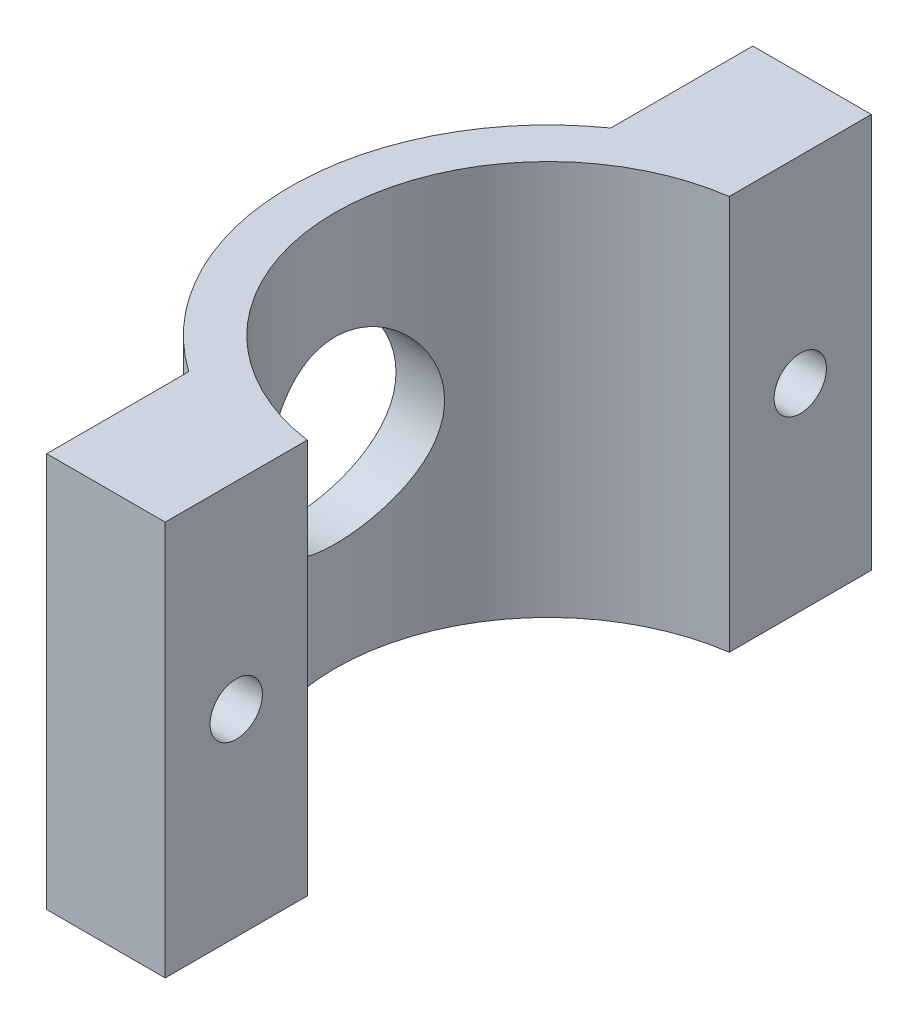
ISO-10303-21;
HEADER;
FILE_DESCRIPTION(('STEP AP214'),'2;1');
FILE_NAME('part.step','',(''),(''),'','','');
FILE_SCHEMA(('AUTOMOTIVE_DESIGN { 1 0 10303 214 1 1 1 1 }'));
ENDSEC;
DATA;
#1=APPLICATION_CONTEXT('core data for automotive mechanical design processes');
#2=APPLICATION_PROTOCOL_DEFINITION('international standard','automotive_design',2000,#1);
#3=PRODUCT_CONTEXT('',#1,'mechanical');
#4=PRODUCT('Part','Part','',(#3));
#5=PRODUCT_RELATED_PRODUCT_CATEGORY('part','',(#4));
#6=PRODUCT_DEFINITION_FORMATION('','',#4);
#7=PRODUCT_DEFINITION_CONTEXT('part definition',#1,'design');
#8=PRODUCT_DEFINITION('design','',#6,#7);
#9=PRODUCT_DEFINITION_SHAPE('','',#8);
#10=(LENGTH_UNIT() NAMED_UNIT(*) SI_UNIT(.MILLI.,.METRE.));
#11=(NAMED_UNIT(*) PLANE_ANGLE_UNIT() SI_UNIT($,.RADIAN.));
#12=(NAMED_UNIT(*) SI_UNIT($,.STERADIAN.) SOLID_ANGLE_UNIT());
#13=UNCERTAINTY_MEASURE_WITH_UNIT(LENGTH_MEASURE(1.E-05),#10,'distance_accuracy_value','');
#14=(GEOMETRIC_REPRESENTATION_CONTEXT(3) GLOBAL_UNCERTAINTY_ASSIGNED_CONTEXT((#13)) GLOBAL_UNIT_ASSIGNED_CONTEXT((#10,
#11,#12)) REPRESENTATION_CONTEXT('',''));
#15=CARTESIAN_POINT('',(0.,0.,0.));
#16=DIRECTION('',(0.,0.,1.));
#17=DIRECTION('',(1.,0.,0.));
#18=AXIS2_PLACEMENT_3D('',#15,#16,#17);
#19=CARTESIAN_POINT('',(-16.5892912198866,20.2908540828622,23.5900554612146));
#20=DIRECTION('',(0.,-1.,0.));
#21=DIRECTION('',(0.,0.,-1.));
#22=AXIS2_PLACEMENT_3D('',#19,#20,#21);
#23=CYLINDRICAL_SURFACE('',#22,14.25);
#24=CARTESIAN_POINT('',(-16.5892912198866,-6.10914591713783,23.5900554612146));
#25=DIRECTION('',(0.,-1.,0.));
#26=DIRECTION('',(0.,0.,-1.));
#27=AXIS2_PLACEMENT_3D('',#24,#25,#26);
#28=CIRCLE('',#27,14.25);
#29=CARTESIAN_POINT('',(-18.5892912198866,-6.10914591713783,37.6990065207371));
#30=VERTEX_POINT('',#29);
#31=CARTESIAN_POINT('',(-18.5892912198866,-6.10914591713783,9.48110440169217));
#32=VERTEX_POINT('',#31);
#33=EDGE_CURVE('E130',#30,#32,#28,.T.);
#34=ORIENTED_EDGE('',*,*,#33,.T.);
#35=DIRECTION('',(0.,-1.,0.));
#36=VECTOR('',#35,1.);
#37=CARTESIAN_POINT('',(-18.5892912198866,20.2908540828622,9.48110440169217));
#38=LINE('',#37,#36);
#39=CARTESIAN_POINT('',(-18.5892912198866,20.2908540828622,9.48110440169217));
#40=VERTEX_POINT('',#39);
#41=EDGE_CURVE('E148',#40,#32,#38,.T.);
#42=ORIENTED_EDGE('',*,*,#41,.F.);
#43=CARTESIAN_POINT('',(-16.5892912198866,20.2908540828622,23.5900554612146));
#44=DIRECTION('',(0.,-1.,0.));
#45=DIRECTION('',(0.,0.,-1.));
#46=AXIS2_PLACEMENT_3D('',#43,#44,#45);
#47=CIRCLE('',#46,14.25);
#48=CARTESIAN_POINT('',(-18.5892912198866,20.2908540828622,37.6990065207371));
#49=VERTEX_POINT('',#48);
#50=EDGE_CURVE('E137',#49,#40,#47,.T.);
#51=ORIENTED_EDGE('',*,*,#50,.F.);
#52=DIRECTION('',(0.,-1.,0.));
#53=VECTOR('',#52,1.);
#54=CARTESIAN_POINT('',(-18.5892912198866,20.2908540828622,37.6990065207371));
#55=LINE('',#54,#53);
#56=EDGE_CURVE('E150',#49,#30,#55,.T.);
#57=ORIENTED_EDGE('',*,*,#56,.T.);
#58=EDGE_LOOP('',(#34,#42,#51,#57));
#59=FACE_BOUND('',#58,.T.);
#60=CARTESIAN_POINT('',(-29.5145571745972,7.09085408286217,17.5900554612146));
#61=CARTESIAN_POINT('',(-29.5145583836085,7.25076014715918,17.5900566121758));
#62=CARTESIAN_POINT('',(-29.517534878097,7.41072103591643,17.5964572174918));
#63=CARTESIAN_POINT('',(-29.5293428523807,7.72947618653543,17.6219941731038));
#64=CARTESIAN_POINT('',(-29.5381781025637,7.88826963051054,17.641138724766));
#65=CARTESIAN_POINT('',(-29.5614255269244,8.20376301387036,17.6920037888573));
#66=CARTESIAN_POINT('',(-29.5758494163356,8.36045783535128,17.7237507225926));
#67=CARTESIAN_POINT('',(-29.6097971951327,8.6703531428413,17.7994904152573));
#68=CARTESIAN_POINT('',(-29.6293232344606,8.82355212611451,17.8434883370177));
#69=CARTESIAN_POINT('',(-29.6727523258704,9.12470529882653,17.9430670699224));
#70=CARTESIAN_POINT('',(-29.696634856618,9.27268035065628,17.9985937374316));
#71=CARTESIAN_POINT('',(-29.7481231376349,9.56327085587394,18.120865226693));
#72=CARTESIAN_POINT('',(-29.7757303084003,9.70588423777432,18.1876143308395));
#73=CARTESIAN_POINT('',(-29.8629509353894,10.1242959055126,18.4038610497906));
#74=CARTESIAN_POINT('',(-29.9270208142709,10.3910413869939,18.5694833488865));
#75=CARTESIAN_POINT('',(-30.0642747362718,10.909079991692,18.9499578226911));
#76=CARTESIAN_POINT('',(-30.1377712880654,11.1585953559592,19.167097908435));
#77=CARTESIAN_POINT('',(-30.2830797042312,11.6191116409902,19.6399129937869));
#78=CARTESIAN_POINT('',(-30.3548909014979,11.8300975276433,19.895602964728));
#79=CARTESIAN_POINT('',(-30.4573334203122,12.1176392167381,20.3095894557195));
#80=CARTESIAN_POINT('',(-30.4912637597656,12.2103013784583,20.456140822951));
#81=CARTESIAN_POINT('',(-30.5557314833105,12.382863561878,20.757265157626));
#82=CARTESIAN_POINT('',(-30.5862701708466,12.4627684915068,20.9118350097488));
#83=CARTESIAN_POINT('',(-30.6430735404045,12.6090823680126,21.2279592447891));
#84=CARTESIAN_POINT('',(-30.6693388250895,12.6754932182422,21.3895126387674));
#85=CARTESIAN_POINT('',(-30.7168255146891,12.7941588100694,21.7184583847181));
#86=CARTESIAN_POINT('',(-30.7380472810556,12.8464145661521,21.8858503172756));
#87=CARTESIAN_POINT('',(-30.7738261249559,12.9338013423763,22.2161598579551));
#88=CARTESIAN_POINT('',(-30.7886767362385,12.9696929697881,22.3788446501493));
#89=CARTESIAN_POINT('',(-30.8128573829621,13.0278597349649,22.7070318464868));
#90=CARTESIAN_POINT('',(-30.82218778359,13.0501357734662,22.8725340634993));
#91=CARTESIAN_POINT('',(-30.8350585687759,13.0808107880413,23.2049881937949));
#92=CARTESIAN_POINT('',(-30.838600896368,13.0892144210385,23.371939601662));
#93=CARTESIAN_POINT('',(-30.8397983291903,13.0920586044305,23.705979456996));
#94=CARTESIAN_POINT('',(-30.8374536683336,13.0864997096107,23.8730678987543));
#95=CARTESIAN_POINT('',(-30.8272752807448,13.0622692488414,24.1956170485107));
#96=CARTESIAN_POINT('',(-30.8197931394654,13.0444374109857,24.3511528233977));
#97=CARTESIAN_POINT('',(-30.7999025487061,12.9967362911083,24.6600990531203));
#98=CARTESIAN_POINT('',(-30.7874925022162,12.9668631067418,24.8135088022686));
#99=CARTESIAN_POINT('',(-30.7580598708356,12.8953837104742,25.1170596847662));
#100=CARTESIAN_POINT('',(-30.7410387983224,12.853781345463,25.2672018724347));
#101=CARTESIAN_POINT('',(-30.7027901910648,12.7592068233655,25.5633662128153));
#102=CARTESIAN_POINT('',(-30.6815610557209,12.7062303393236,25.7093867735871));
#103=CARTESIAN_POINT('',(-30.6350567564275,12.5884898066774,25.9985238119138));
#104=CARTESIAN_POINT('',(-30.6097261359449,12.5235622322296,26.1415648474036));
#105=CARTESIAN_POINT('',(-30.5558539250813,12.3829786056552,26.4216645186344));
#106=CARTESIAN_POINT('',(-30.5273111629007,12.3073186356776,26.5587209456984));
#107=CARTESIAN_POINT('',(-30.4378419829683,12.0650325806581,26.9597667493119));
#108=CARTESIAN_POINT('',(-30.3730438580912,11.8830250728856,27.2138162957244));
#109=CARTESIAN_POINT('',(-30.2342100694426,11.4683180092497,27.7069871449134));
#110=CARTESIAN_POINT('',(-30.1598451980582,11.2329178865633,27.9437286500461));
#111=CARTESIAN_POINT('',(-30.0136614884827,10.7254177530026,28.3755323963779));
#112=CARTESIAN_POINT('',(-29.9418436843916,10.4533030467524,28.5705778671184));
#113=CARTESIAN_POINT('',(-29.8409718801019,10.0175432691812,28.8307172712376));
#114=CARTESIAN_POINT('',(-29.8079988499797,9.86488181826001,28.9131162739378));
#115=CARTESIAN_POINT('',(-29.7459672917838,9.5523650451889,29.0646395111713));
#116=CARTESIAN_POINT('',(-29.7169071581055,9.39251270986488,29.1337691955772));
#117=CARTESIAN_POINT('',(-29.663725199551,9.06674380760944,29.2580579244257));
#118=CARTESIAN_POINT('',(-29.6396015068586,8.90082956245052,29.3132222548625));
#119=CARTESIAN_POINT('',(-29.5971792513203,8.56412388813348,29.4089985440882));
#120=CARTESIAN_POINT('',(-29.5788801564926,8.39333290593923,29.4496118319197));
#121=CARTESIAN_POINT('',(-29.5498196137541,8.05965610533712,29.5135978529789));
#122=CARTESIAN_POINT('',(-29.5386412410059,7.89699009129641,29.5379295823282));
#123=CARTESIAN_POINT('',(-29.5224008780864,7.56991029036197,29.5731612231141));
#124=CARTESIAN_POINT('',(-29.5173384639656,7.40549662541007,29.5840620655618));
#125=CARTESIAN_POINT('',(-29.5135177053477,7.07630650617094,29.5922958955461));
#126=CARTESIAN_POINT('',(-29.5147574803482,6.91153017476661,29.5896329303699));
#127=CARTESIAN_POINT('',(-29.5234908115885,6.58292405031146,29.5707819122945));
#128=CARTESIAN_POINT('',(-29.5309841725202,6.41909422786074,29.5545942817895));
#129=CARTESIAN_POINT('',(-29.5512514938468,6.10449318967008,29.5104126580604));
#130=CARTESIAN_POINT('',(-29.5636425017483,5.95357620950677,29.4832723829172));
#131=CARTESIAN_POINT('',(-29.5932526635943,5.65466502127067,29.417643457986));
#132=CARTESIAN_POINT('',(-29.610473366726,5.50667176735245,29.3791511666875));
#133=CARTESIAN_POINT('',(-29.6492250765592,5.21460118236085,29.2911898716802));
#134=CARTESIAN_POINT('',(-29.6707552843622,5.07052313109901,29.24172290228));
#135=CARTESIAN_POINT('',(-29.7175288423381,4.78701314604419,29.1322049510754));
#136=CARTESIAN_POINT('',(-29.7427736210167,4.64758302511276,29.0721498956613));
#137=CARTESIAN_POINT('',(-29.7974336746334,4.36834373310683,28.9391541136997));
#138=CARTESIAN_POINT('',(-29.8269803952604,4.22876915615258,28.8657749965815));
#139=CARTESIAN_POINT('',(-29.8885765196168,3.95618869826312,28.7085163027878));
#140=CARTESIAN_POINT('',(-29.9206267761202,3.82318508098578,28.6246331422229));
#141=CARTESIAN_POINT('',(-29.9864027473475,3.5644165572684,28.4468940839713));
#142=CARTESIAN_POINT('',(-30.0201288063038,3.43865314961398,28.3530361327801));
#143=CARTESIAN_POINT('',(-30.0884230728242,3.19499208553419,28.1558874684571));
#144=CARTESIAN_POINT('',(-30.1229913184433,3.07709478545121,28.0525963284938));
#145=CARTESIAN_POINT('',(-30.1950497326266,2.84021404957303,27.8280821245168));
#146=CARTESIAN_POINT('',(-30.2325421435275,2.72196662065797,27.7060817513037));
#147=CARTESIAN_POINT('',(-30.3065251054627,2.49614132003793,27.4523667804318));
#148=CARTESIAN_POINT('',(-30.3430159629879,2.38856015735748,27.3206552010807));
#149=CARTESIAN_POINT('',(-30.4140464115812,2.18468530533864,27.04815828095));
#150=CARTESIAN_POINT('',(-30.4485850131746,2.08839731368145,26.9073684149925));
#151=CARTESIAN_POINT('',(-30.5147415946124,1.90792875409695,26.6176610668573));
#152=CARTESIAN_POINT('',(-30.5463608319247,1.82374296456052,26.4687471283771));
#153=CARTESIAN_POINT('',(-30.6059405276127,1.6678318859614,26.1630653753093));
#154=CARTESIAN_POINT('',(-30.6338862062094,1.59615657277561,26.0062691448532));
#155=CARTESIAN_POINT('',(-30.6851642084279,1.4663817569143,25.6864975549699));
#156=CARTESIAN_POINT('',(-30.7084984922774,1.40827648392164,25.5235248563202));
#157=CARTESIAN_POINT('',(-30.7498763200697,1.30623252124307,25.1925927718756));
#158=CARTESIAN_POINT('',(-30.7679213552103,1.26228983834966,25.0246348063113));
#159=CARTESIAN_POINT('',(-30.7981812898424,1.18906013145603,24.6850406233837));
#160=CARTESIAN_POINT('',(-30.8103966380063,1.15977197958508,24.5134046901518));
#161=CARTESIAN_POINT('',(-30.8279720685385,1.11775889707986,24.1802173472841));
#162=CARTESIAN_POINT('',(-30.8337581613235,1.10400352607752,24.0188175701368));
#163=CARTESIAN_POINT('',(-30.839820355307,1.08959380349087,23.6953332200447));
#164=CARTESIAN_POINT('',(-30.8400966957483,1.08893888306264,23.5332486771394));
#165=CARTESIAN_POINT('',(-30.835132290488,1.10073591072885,23.2096716612573));
#166=CARTESIAN_POINT('',(-30.8298924664685,1.11318566919535,23.0481790938924));
#167=CARTESIAN_POINT('',(-30.8140397769229,1.15105047254991,22.7269903501511));
#168=CARTESIAN_POINT('',(-30.8034269490774,1.17646542651413,22.5672941611848));
#169=CARTESIAN_POINT('',(-30.7776020571323,1.23880860087672,22.2567473313803));
#170=CARTESIAN_POINT('',(-30.7625750128576,1.27527524354339,22.1057882060206));
#171=CARTESIAN_POINT('',(-30.7281648685117,1.35964726567407,21.8075596387567));
#172=CARTESIAN_POINT('',(-30.7087803430372,1.40755638848181,21.6602914217698));
#173=CARTESIAN_POINT('',(-30.6661234068838,1.51437667196321,21.3704262220109));
#174=CARTESIAN_POINT('',(-30.6428518729614,1.5732853519214,21.2278281944839));
#175=CARTESIAN_POINT('',(-30.5929463583845,1.70166536834076,20.9480203416483));
#176=CARTESIAN_POINT('',(-30.5663110974187,1.7711407287898,20.8108125942128));
#177=CARTESIAN_POINT('',(-30.5090220634849,1.92349394398499,20.5365170681978));
#178=CARTESIAN_POINT('',(-30.4782413739809,2.0068343111283,20.3997126869902));
#179=CARTESIAN_POINT('',(-30.4143988017445,2.18392814405454,20.1335189817008));
#180=CARTESIAN_POINT('',(-30.3813361346355,2.27768519714981,20.0041322355144));
#181=CARTESIAN_POINT('',(-30.3137176759507,2.47501471261057,19.753458676168));
#182=CARTESIAN_POINT('',(-30.2791616530829,2.57858869841426,19.6321731251846));
#183=CARTESIAN_POINT('',(-30.2093791072864,2.79495146982567,19.3983257495283));
#184=CARTESIAN_POINT('',(-30.1741525589775,2.90774060477095,19.2857642558916));
#185=CARTESIAN_POINT('',(-30.1014112896164,3.15014688899134,19.0623785003179));
#186=CARTESIAN_POINT('',(-30.0639090322278,3.28038934257084,18.9522275657922));
#187=CARTESIAN_POINT('',(-29.9901735999305,3.54995768432053,18.7432911456315));
#188=CARTESIAN_POINT('',(-29.9539400139568,3.68928058765441,18.6445019545013));
#189=CARTESIAN_POINT('',(-29.8837589200456,3.97640944868975,18.4588283429624));
#190=CARTESIAN_POINT('',(-29.8498137790308,4.12422390521201,18.3719561549952));
#191=CARTESIAN_POINT('',(-29.7853245746244,4.42726660642574,18.2109547043974));
#192=CARTESIAN_POINT('',(-29.7547789683336,4.58249144178552,18.1368196525658));
#193=CARTESIAN_POINT('',(-29.698189024312,4.89886178630751,18.0021561899573));
#194=CARTESIAN_POINT('',(-29.6721289740204,5.05998412726758,17.9415800495973));
#195=CARTESIAN_POINT('',(-29.6253097079745,5.38747024288956,17.834349683296));
#196=CARTESIAN_POINT('',(-29.6045478854873,5.55383139461457,17.7876886092171));
#197=CARTESIAN_POINT('',(-29.5691357563836,5.89012464628686,17.7088991507169));
#198=CARTESIAN_POINT('',(-29.5544693365528,6.06004606781954,17.6767324312022));
#199=CARTESIAN_POINT('',(-29.5317554755871,6.40237929981162,17.6271810059948));
#200=CARTESIAN_POINT('',(-29.5237029146695,6.57478907862681,17.6097848660561));
#201=CARTESIAN_POINT('',(-29.5175959855602,6.80477802038827,17.5966055972561));
#202=CARTESIAN_POINT('',(-29.5164572285054,6.861957035872,17.5941500331474));
#203=CARTESIAN_POINT('',(-29.5149376022552,6.97637305276871,17.5908747496924));
#204=CARTESIAN_POINT('',(-29.5145567417889,7.03361005484195,17.5900550491874));
#205=CARTESIAN_POINT('',(-29.5145571745972,7.09085408286217,17.5900554612146));
#206=B_SPLINE_CURVE_WITH_KNOTS('',3,(#60,#61,#62,#63,#64,#65,#66,#67,#68,#69,#70,#71,#72,#73,
#74,#75,#76,#77,#78,#79,#80,#81,#82,#83,#84,#85,#86,#87,#88,#89,#90,#91,#92,#93,#94,#95,#96,#97,
#98,#99,#100,#101,#102,#103,#104,#105,#106,#107,#108,#109,#110,#111,#112,#113,#114,#115,#116,
#117,#118,#119,#120,#121,#122,#123,#124,#125,#126,#127,#128,#129,#130,#131,#132,#133,#134,#135,
#136,#137,#138,#139,#140,#141,#142,#143,#144,#145,#146,#147,#148,#149,#150,#151,#152,#153,#154,
#155,#156,#157,#158,#159,#160,#161,#162,#163,#164,#165,#166,#167,#168,#169,#170,#171,#172,#173,
#174,#175,#176,#177,#178,#179,#180,#181,#182,#183,#184,#185,#186,#187,#188,#189,#190,#191,#192,
#193,#194,#195,#196,#197,#198,#199,#200,#201,#202,#203,#204,#205),.UNSPECIFIED.,.T.,.F.,(4,2,2,
2,2,2,2,2,2,2,2,2,2,2,2,2,2,2,2,2,2,2,2,2,2,2,2,2,2,2,2,2,2,2,2,2,2,2,2,2,2,2,2,2,2,2,2,2,2,2,2,
2,2,2,2,2,2,2,2,2,2,2,2,2,2,2,2,2,2,2,2,2,4),(0.,0.479658550333423,0.959626083723095,
1.44060524473132,1.92178740832077,2.40075888969591,2.87991355940919,3.83703621975156,
4.84934520116691,5.86204834305998,6.39151973891451,6.92078694448858,7.44997944452004,
7.97913400767255,8.48025330368791,8.98133944468391,9.48225733838753,9.98315532899245,
10.4528026394743,10.9226022752094,11.3922480068184,11.8620727191671,12.3388818274416,
12.815865444529,13.7692368171871,14.7910280439312,15.8132294727757,16.3424163279383,
16.8713853722912,17.4001538974074,17.9288741142848,18.4227863806872,18.9166644078249,
19.410395075967,19.9041103247913,20.3650993145386,20.8262363419154,21.2872879624657,
21.7485173544498,22.2293030319276,22.7102531986101,23.1913025707382,23.6723737200994,
24.1937353957698,24.7149357063377,25.2363978542428,25.7576343327416,26.2809075855263,
26.803957922774,27.326860654291,27.8497231349506,28.3353741109354,28.8210039990806,
29.3065527574236,29.7920981106999,30.2596495130101,30.7273540821787,31.1949532976835,
31.6627310315788,32.151564505893,32.6405668502273,33.1296452049011,33.6187421086818,
34.1420805442489,34.6652478123876,35.1889481404912,35.7124098063599,36.2339987623913,
36.755330599266,37.2752753907515,37.7948173130635,37.9665260682777,38.1382368011766),.UNSPECIFIED.);
#207=CARTESIAN_POINT('',(-29.5145571745972,7.09085408286217,17.5900554612146));
#208=VERTEX_POINT('',#207);
#209=EDGE_CURVE('E124',#208,#208,#206,.T.);
#210=ORIENTED_EDGE('',*,*,#209,.F.);
#211=EDGE_LOOP('',(#210));
#212=FACE_BOUND('',#211,.T.);
#213=ADVANCED_FACE('F32',(#59,#212),#23,.F.);
#214=CARTESIAN_POINT('',(-16.5892912198866,47.7494940010885,23.5900554612146));
#215=DIRECTION('',(0.,-1.,0.));
#216=DIRECTION('',(0.,0.,-1.));
#217=AXIS2_PLACEMENT_3D('',#214,#215,#216);
#218=CYLINDRICAL_SURFACE('',#217,17.25);
#219=CARTESIAN_POINT('',(-16.5892912198866,20.2908540828622,23.5900554612146));
#220=DIRECTION('',(0.,-1.,0.));
#221=DIRECTION('',(0.,0.,-1.));
#222=AXIS2_PLACEMENT_3D('',#219,#220,#221);
#223=CIRCLE('',#222,17.25);
#224=CARTESIAN_POINT('',(-26.5140078405262,20.2908540828622,37.6990065207371));
#225=VERTEX_POINT('',#224);
#226=CARTESIAN_POINT('',(-26.5140078405262,20.2908540828622,9.48110440169217));
#227=VERTEX_POINT('',#226);
#228=EDGE_CURVE('E184',#225,#227,#223,.T.);
#229=ORIENTED_EDGE('',*,*,#228,.T.);
#230=DIRECTION('',(0.,-1.,0.));
#231=VECTOR('',#230,1.);
#232=CARTESIAN_POINT('',(-26.5140078405262,47.7494940010885,9.48110440169217));
#233=LINE('',#232,#231);
#234=CARTESIAN_POINT('',(-26.5140078405262,-6.10914591713783,9.48110440169217));
#235=VERTEX_POINT('',#234);
#236=EDGE_CURVE('E113',#227,#235,#233,.T.);
#237=ORIENTED_EDGE('',*,*,#236,.T.);
#238=CARTESIAN_POINT('',(-16.5892912198866,-6.10914591713783,23.5900554612146));
#239=DIRECTION('',(0.,-1.,0.));
#240=DIRECTION('',(0.,0.,-1.));
#241=AXIS2_PLACEMENT_3D('',#238,#239,#240);
#242=CIRCLE('',#241,17.25);
#243=CARTESIAN_POINT('',(-26.5140078405262,-6.10914591713783,37.6990065207371));
#244=VERTEX_POINT('',#243);
#245=EDGE_CURVE('E44',#244,#235,#242,.T.);
#246=ORIENTED_EDGE('',*,*,#245,.F.);
#247=DIRECTION('',(0.,-1.,0.));
#248=VECTOR('',#247,1.);
#249=CARTESIAN_POINT('',(-26.5140078405262,47.7494940010885,37.6990065207371));
#250=LINE('',#249,#248);
#251=EDGE_CURVE('E172',#225,#244,#250,.T.);
#252=ORIENTED_EDGE('',*,*,#251,.F.);
#253=EDGE_LOOP('',(#229,#237,#246,#252));
#254=FACE_BOUND('',#253,.T.);
#255=CARTESIAN_POINT('',(-33.8392912198866,1.09085408286216,23.5900554612146));
#256=CARTESIAN_POINT('',(-33.8392914142403,1.09085380395827,23.4268095969181));
#257=CARTESIAN_POINT('',(-33.8369687023404,1.09752163270939,23.2635678695208));
#258=CARTESIAN_POINT('',(-33.8277403406504,1.12413101084509,22.9382425320737));
#259=CARTESIAN_POINT('',(-33.8208330956436,1.1440771805182,22.7761593449944));
#260=CARTESIAN_POINT('',(-33.802625417101,1.19704452692924,22.4544613036394));
#261=CARTESIAN_POINT('',(-33.7913266505983,1.23006074233146,22.2948455366021));
#262=CARTESIAN_POINT('',(-33.7646341338666,1.30887533711489,21.9790895219803));
#263=CARTESIAN_POINT('',(-33.7492387987757,1.3546786638538,21.8229506449087));
#264=CARTESIAN_POINT('',(-33.7147994262808,1.45854330431281,21.5156082870836));
#265=CARTESIAN_POINT('',(-33.6957634220223,1.51657765846841,21.364394782549));
#266=CARTESIAN_POINT('',(-33.6545043152259,1.64451001345234,21.0674613093039));
#267=CARTESIAN_POINT('',(-33.6322800330905,1.71441240697598,20.9217433991623));
#268=CARTESIAN_POINT('',(-33.5852164057281,1.86551919891406,20.6367722179342));
#269=CARTESIAN_POINT('',(-33.5603775458281,1.94672150069818,20.4975177539711));
#270=CARTESIAN_POINT('',(-33.5086906243018,2.11989778560659,20.2262027708754));
#271=CARTESIAN_POINT('',(-33.4818418414743,2.21187564197198,20.094144863668));
#272=CARTESIAN_POINT('',(-33.4258825607281,2.40923489004336,19.8337249040345));
#273=CARTESIAN_POINT('',(-33.3967264419198,2.51496183560862,19.705634445099));
#274=CARTESIAN_POINT('',(-33.3377478687526,2.73657952037536,19.4587344187122));
#275=CARTESIAN_POINT('',(-33.3079253980768,2.85247050866835,19.3399250788496));
#276=CARTESIAN_POINT('',(-33.2483908144891,3.0937588120516,19.1122486189035));
#277=CARTESIAN_POINT('',(-33.2186787516371,3.2191599912853,19.0033855802007));
#278=CARTESIAN_POINT('',(-33.1601878255644,3.47864098577987,18.7963664368131));
#279=CARTESIAN_POINT('',(-33.1314086473098,3.61271782447291,18.6982066906032));
#280=CARTESIAN_POINT('',(-33.0746668207563,3.89326458303323,18.5102085774849));
#281=CARTESIAN_POINT('',(-33.0467605244286,4.03999485282781,18.420741142769));
#282=CARTESIAN_POINT('',(-32.99364369369,4.34090900694071,18.2545770920636));
#283=CARTESIAN_POINT('',(-32.9684320911673,4.49508990255708,18.1778754092706));
#284=CARTESIAN_POINT('',(-32.9214920211972,4.80995198181498,18.037832839939));
#285=CARTESIAN_POINT('',(-32.8997641019652,4.9706341835722,17.97449405578));
#286=CARTESIAN_POINT('',(-32.8605304922826,5.29725654599934,17.8618065241755));
#287=CARTESIAN_POINT('',(-32.8430228415906,5.46319422491176,17.8124512797432));
#288=CARTESIAN_POINT('',(-32.8133668075667,5.79310848566698,17.729702718825));
#289=CARTESIAN_POINT('',(-32.8010488696037,5.95694228480698,17.695800823326));
#290=CARTESIAN_POINT('',(-32.7813076936411,6.28709267656484,17.6417840780065));
#291=CARTESIAN_POINT('',(-32.7738823823787,6.45340818695811,17.6216633882231));
#292=CARTESIAN_POINT('',(-32.7641736381205,6.78727371874193,17.5954015350421));
#293=CARTESIAN_POINT('',(-32.761889717894,6.95482362164373,17.589259046981));
#294=CARTESIAN_POINT('',(-32.7625419607696,7.28983675602191,17.5910170007864));
#295=CARTESIAN_POINT('',(-32.7654779590295,7.45729999006819,17.5989169991986));
#296=CARTESIAN_POINT('',(-32.7761884057107,7.78236431202424,17.6279182167766));
#297=CARTESIAN_POINT('',(-32.7837105497248,7.94003571130811,17.6483313319743));
#298=CARTESIAN_POINT('',(-32.8031370318867,8.25305245362421,17.7015492249371));
#299=CARTESIAN_POINT('',(-32.8150428383352,8.40839699911638,17.7343581547565));
#300=CARTESIAN_POINT('',(-32.8428738745334,8.71561550548743,17.8120583768806));
#301=CARTESIAN_POINT('',(-32.8587980057416,8.86749040255396,17.856946367198));
#302=CARTESIAN_POINT('',(-32.8942096764399,9.16690252529165,17.9584463392581));
#303=CARTESIAN_POINT('',(-32.9136985720512,9.31443807529288,18.0150627838737));
#304=CARTESIAN_POINT('',(-32.9560404978766,9.60665060647109,18.1406080483687));
#305=CARTESIAN_POINT('',(-32.9789443490262,9.75123848755295,18.2097269838021));
#306=CARTESIAN_POINT('',(-33.0272370008497,10.034151521886,18.3591281317696));
#307=CARTESIAN_POINT('',(-33.0526266482047,10.172474517642,18.4394141518421));
#308=CARTESIAN_POINT('',(-33.1052076659612,10.4420444013806,18.6105957931738));
#309=CARTESIAN_POINT('',(-33.132399188,10.5732906921309,18.701492307854));
#310=CARTESIAN_POINT('',(-33.1878812103228,10.8279841901066,18.8933248566362));
#311=CARTESIAN_POINT('',(-33.2161717530556,10.9514310956017,18.9942612787579));
#312=CARTESIAN_POINT('',(-33.2747792458512,11.196703082152,19.2116566438729));
#313=CARTESIAN_POINT('',(-33.3051192944114,11.318028255477,19.3286740399706));
#314=CARTESIAN_POINT('',(-33.3653935361667,11.5504170019534,19.5725119098759));
#315=CARTESIAN_POINT('',(-33.395327852769,11.661483757905,19.6993293205279));
#316=CARTESIAN_POINT('',(-33.4540042478784,11.8727311696247,19.9620970576348));
#317=CARTESIAN_POINT('',(-33.4827457305749,11.9729064246952,20.0980518614105));
#318=CARTESIAN_POINT('',(-33.5382303222568,12.1615704743981,20.3781501606042));
#319=CARTESIAN_POINT('',(-33.5649742223354,12.2500639060954,20.5222903741562));
#320=CARTESIAN_POINT('',(-33.6160532885548,12.4157403952755,20.8196930773896));
#321=CARTESIAN_POINT('',(-33.6403553579036,12.4927734844806,20.9730449085352));
#322=CARTESIAN_POINT('',(-33.6854766031786,12.6335520737662,21.2861565311815));
#323=CARTESIAN_POINT('',(-33.7062971394891,12.6973027662552,21.4459137894126));
#324=CARTESIAN_POINT('',(-33.7438613848911,12.8109638921017,21.7707298735388));
#325=CARTESIAN_POINT('',(-33.7606055216386,12.8608757773676,21.9357881412455));
#326=CARTESIAN_POINT('',(-33.7895232296066,12.9463730571284,22.2699650086306));
#327=CARTESIAN_POINT('',(-33.8016970320183,12.9819591763009,22.4390834024663));
#328=CARTESIAN_POINT('',(-33.820654717094,13.0371155029655,22.7720635833292));
#329=CARTESIAN_POINT('',(-33.827663888391,13.0573564294176,22.9358017051635));
#330=CARTESIAN_POINT('',(-33.8370028801139,13.0842853618846,23.2645196113019));
#331=CARTESIAN_POINT('',(-33.8393328629014,13.090973838151,23.429499352324));
#332=CARTESIAN_POINT('',(-33.8392484525008,13.0907310950115,23.7594196279877));
#333=CARTESIAN_POINT('',(-33.8368348340519,13.0838020996518,23.9243601646319));
#334=CARTESIAN_POINT('',(-33.8273322045666,13.0563986602126,24.2529743415128));
#335=CARTESIAN_POINT('',(-33.8202432482071,13.0359243745417,24.4166479965427));
#336=CARTESIAN_POINT('',(-33.8018890854584,12.9825118092684,24.7362523054336));
#337=CARTESIAN_POINT('',(-33.7907661875431,12.9499975360748,24.8922622870732));
#338=CARTESIAN_POINT('',(-33.76460877314,12.8727528521125,25.2009459522469));
#339=CARTESIAN_POINT('',(-33.7495729592266,12.8280183891877,25.353618510939));
#340=CARTESIAN_POINT('',(-33.7159755792275,12.7267300139754,25.6545409691663));
#341=CARTESIAN_POINT('',(-33.6974149616533,12.6701792809925,25.8027920461162));
#342=CARTESIAN_POINT('',(-33.6572174671377,12.5456755599729,26.094055794361));
#343=CARTESIAN_POINT('',(-33.6355794257535,12.4777182541287,26.2370664568969));
#344=CARTESIAN_POINT('',(-33.5891357857117,12.328920981335,26.520755299593));
#345=CARTESIAN_POINT('',(-33.564260167477,12.2477814800769,26.6612648870138));
#346=CARTESIAN_POINT('',(-33.5124422272219,12.0745645589401,26.9350336516808));
#347=CARTESIAN_POINT('',(-33.4854991945544,11.982483371978,27.0682903086783));
#348=CARTESIAN_POINT('',(-33.4302233033098,11.7880004870446,27.3267621037797));
#349=CARTESIAN_POINT('',(-33.4018902849535,11.6855976011593,27.4519763135652));
#350=CARTESIAN_POINT('',(-33.3445424130897,11.4711075539972,27.6936495978527));
#351=CARTESIAN_POINT('',(-33.3155275394402,11.3590201063767,27.8101084132932));
#352=CARTESIAN_POINT('',(-33.2560946284985,11.1199848337283,28.0391968817191));
#353=CARTESIAN_POINT('',(-33.2256788579206,10.9925744831404,28.15134509031));
#354=CARTESIAN_POINT('',(-33.1657619157176,10.7286269485614,28.3645058292968));
#355=CARTESIAN_POINT('',(-33.1362604470565,10.5920927751708,28.4655220040835));
#356=CARTESIAN_POINT('',(-33.0789996043254,10.3106322490542,28.6558128063832));
#357=CARTESIAN_POINT('',(-33.0512410069228,10.165702209458,28.7450822183889));
#358=CARTESIAN_POINT('',(-32.9983226009752,9.8684757734282,28.9111251643343));
#359=CARTESIAN_POINT('',(-32.9731617068145,9.71618249358372,28.9879039260742));
#360=CARTESIAN_POINT('',(-32.9262059713953,9.40513968725948,29.1283952437333));
#361=CARTESIAN_POINT('',(-32.9044118068313,9.24638887092937,29.1921051737299));
#362=CARTESIAN_POINT('',(-32.864915342498,8.92363231253847,29.3058394318491));
#363=CARTESIAN_POINT('',(-32.8472113422886,8.7596287866391,29.3558694488363));
#364=CARTESIAN_POINT('',(-32.8164892740999,8.42755820148618,29.4417755083983));
#365=CARTESIAN_POINT('',(-32.8034702126842,8.25949201179227,29.4776545518277));
#366=CARTESIAN_POINT('',(-32.7825728464911,7.92059144278068,29.5348904483994));
#367=CARTESIAN_POINT('',(-32.7746942507879,7.7497572206813,29.5562481233846));
#368=CARTESIAN_POINT('',(-32.7646503145377,7.41633737905687,29.583422816209));
#369=CARTESIAN_POINT('',(-32.7621897109737,7.25382563701358,29.5900432094017));
#370=CARTESIAN_POINT('',(-32.7621807196181,6.92874308831185,29.590067682241));
#371=CARTESIAN_POINT('',(-32.7646339969831,6.76617228030269,29.5834672817846));
#372=CARTESIAN_POINT('',(-32.7743740310908,6.44232251817517,29.5571141893183));
#373=CARTESIAN_POINT('',(-32.7816586268786,6.28104301910512,29.5373673774274));
#374=CARTESIAN_POINT('',(-32.8008277106961,5.96082293256085,29.4849144687987));
#375=CARTESIAN_POINT('',(-32.8127139281014,5.80188324777146,29.4522034997778));
#376=CARTESIAN_POINT('',(-32.8403888218359,5.4911432115514,29.3750328935724));
#377=CARTESIAN_POINT('',(-32.8560815098103,5.33926273240797,29.3308606130167));
#378=CARTESIAN_POINT('',(-32.8910482545722,5.03977862744594,29.2308022759587));
#379=CARTESIAN_POINT('',(-32.9103235765826,4.8921765339112,29.1749120803278));
#380=CARTESIAN_POINT('',(-32.9519077195444,4.60221870123587,29.0518769623281));
#381=CARTESIAN_POINT('',(-32.9742160176504,4.459862063212,28.9847339793286));
#382=CARTESIAN_POINT('',(-33.0212762499068,4.18112677658353,28.8396443841155));
#383=CARTESIAN_POINT('',(-33.0460290633761,4.04475030476917,28.7616938802164));
#384=CARTESIAN_POINT('',(-33.0985273809927,3.77256635946793,28.5916453447469));
#385=CARTESIAN_POINT('',(-33.1263585803341,3.63708131934012,28.4990574326929));
#386=CARTESIAN_POINT('',(-33.1832298268588,3.37430213887111,28.3032384593266));
#387=CARTESIAN_POINT('',(-33.2122699204991,3.24700831379216,28.200006988764));
#388=CARTESIAN_POINT('',(-33.2708017759498,3.00128919494258,27.9834919266314));
#389=CARTESIAN_POINT('',(-33.3002937258159,2.88286772151452,27.8702040502289));
#390=CARTESIAN_POINT('',(-33.3589421382852,2.65568397687497,27.6343195411717));
#391=CARTESIAN_POINT('',(-33.3880987060409,2.54691860212562,27.5117259231193));
#392=CARTESIAN_POINT('',(-33.4466084674305,2.33507172827766,27.2522692732631));
#393=CARTESIAN_POINT('',(-33.475913112719,2.23245572872297,27.1150146389707));
#394=CARTESIAN_POINT('',(-33.5325232471668,2.03920620833143,26.8319998404651));
#395=CARTESIAN_POINT('',(-33.5598294783801,1.9485682296231,26.6862428698511));
#396=CARTESIAN_POINT('',(-33.6116954224683,1.77990420969092,26.3870728556923));
#397=CARTESIAN_POINT('',(-33.6362542856504,1.7018820669281,26.2336574646873));
#398=CARTESIAN_POINT('',(-33.6819036246315,1.55917532586417,25.9203238524439));
#399=CARTESIAN_POINT('',(-33.702995628231,1.49448484926236,25.7604085346021));
#400=CARTESIAN_POINT('',(-33.740825474851,1.37985486603049,25.4375905608811));
#401=CARTESIAN_POINT('',(-33.75762356982,1.32970973365465,25.274768039032));
#402=CARTESIAN_POINT('',(-33.786779754506,1.24339623079912,24.9451380968085));
#403=CARTESIAN_POINT('',(-33.7991396973875,1.20722202623593,24.7783323707358));
#404=CARTESIAN_POINT('',(-33.8190651183239,1.14919166623761,24.4419772240965));
#405=CARTESIAN_POINT('',(-33.8266309801592,1.12733436468741,24.2724280242675));
#406=CARTESIAN_POINT('',(-33.8367438362901,1.09816598825997,23.9319361568349));
#407=CARTESIAN_POINT('',(-33.8392910163749,1.09085437490812,23.76099354105));
#408=CARTESIAN_POINT('',(-33.8392912198866,1.09085408286216,23.5900554612146));
#409=B_SPLINE_CURVE_WITH_KNOTS('',3,(#255,#256,#257,#258,#259,#260,#261,#262,#263,#264,#265,
#266,#267,#268,#269,#270,#271,#272,#273,#274,#275,#276,#277,#278,#279,#280,#281,#282,#283,#284,
#285,#286,#287,#288,#289,#290,#291,#292,#293,#294,#295,#296,#297,#298,#299,#300,#301,#302,#303,
#304,#305,#306,#307,#308,#309,#310,#311,#312,#313,#314,#315,#316,#317,#318,#319,#320,#321,#322,
#323,#324,#325,#326,#327,#328,#329,#330,#331,#332,#333,#334,#335,#336,#337,#338,#339,#340,#341,
#342,#343,#344,#345,#346,#347,#348,#349,#350,#351,#352,#353,#354,#355,#356,#357,#358,#359,#360,
#361,#362,#363,#364,#365,#366,#367,#368,#369,#370,#371,#372,#373,#374,#375,#376,#377,#378,#379,
#380,#381,#382,#383,#384,#385,#386,#387,#388,#389,#390,#391,#392,#393,#394,#395,#396,#397,#398,
#399,#400,#401,#402,#403,#404,#405,#406,#407,#408),.UNSPECIFIED.,.T.,.F.,(4,2,2,2,2,2,2,2,2,2,2,
2,2,2,2,2,2,2,2,2,2,2,2,2,2,2,2,2,2,2,2,2,2,2,2,2,2,2,2,2,2,2,2,2,2,2,2,2,2,2,2,2,2,2,2,2,2,2,2,
2,2,2,2,2,2,2,2,2,2,2,2,2,2,2,2,2,4),(0.,0.489578581225204,0.979327603731688,1.46889089751096,
1.95864386739095,2.44732841008984,2.9361942245867,3.42496945360197,3.91392091360088,
4.41923588463872,4.92456324295814,5.43009703544603,5.93545829260066,6.4571338443122,
6.9786018435276,7.50015182401993,8.02145908478556,8.52408686379002,9.02650151581308,
9.5288685538401,10.0312197276675,10.5081556867122,10.9852515402259,11.4622171048999,
11.939364497429,12.4244934692353,12.9097882583579,13.3951239396126,13.8804783852854,
14.3936948521304,14.9067515485774,15.4200615018598,15.9331670816343,16.4524872051507,
16.9716039314336,17.4906661735803,18.009702155345,18.5044833990507,18.9992474742259,
19.4939307497628,19.9886082402067,20.4673055383806,20.9461617633616,21.4248893120485,
21.9037984871076,22.3957029054844,22.8877771736886,23.3799081390297,23.8720536602066,
24.3887695212578,24.9053157148324,25.4220904841577,25.9386484045189,26.4553100155101,
26.9717564421218,27.4880932921763,28.0044009174993,28.4917923227541,28.9793489172674,
29.4666875841423,29.9542095800958,30.4305247075577,30.907008368522,31.3834099938687,
31.8599836146175,32.3587572508843,32.8575500724085,33.3565564490984,33.8554018565662,
34.3763543489637,34.8971124086504,35.418031083232,35.9387195765869,36.4516417617578,
36.9643495248944,37.4770162390743,37.9896639742178),.UNSPECIFIED.);
#410=CARTESIAN_POINT('',(-33.8392912198866,1.09085408286216,23.5900554612146));
#411=VERTEX_POINT('',#410);
#412=EDGE_CURVE('E11',#411,#411,#409,.T.);
#413=ORIENTED_EDGE('',*,*,#412,.T.);
#414=EDGE_LOOP('',(#413));
#415=FACE_BOUND('',#414,.T.);
#416=ADVANCED_FACE('F170',(#254,#415),#218,.T.);
#417=CARTESIAN_POINT('',(-36.8392912198866,20.2908540828622,-0.0188955983078283));
#418=DIRECTION('',(0.,0.,1.));
#419=DIRECTION('',(1.,0.,0.));
#420=AXIS2_PLACEMENT_3D('',#417,#418,#419);
#421=PLANE('',#420);
#422=DIRECTION('',(0.,-1.,0.));
#423=VECTOR('',#422,1.);
#424=CARTESIAN_POINT('',(-26.5140078405262,47.7494940010885,-0.0188955983078243));
#425=LINE('',#424,#423);
#426=CARTESIAN_POINT('',(-26.5140078405262,20.2908540828622,-0.0188955983078243));
#427=VERTEX_POINT('',#426);
#428=CARTESIAN_POINT('',(-26.5140078405262,-6.10914591713783,-0.0188955983078263));
#429=VERTEX_POINT('',#428);
#430=EDGE_CURVE('E51',#427,#429,#425,.T.);
#431=ORIENTED_EDGE('',*,*,#430,.F.);
#432=DIRECTION('',(-1.,0.,0.));
#433=VECTOR('',#432,1.);
#434=CARTESIAN_POINT('',(-36.8392912198866,20.2908540828622,-0.0188955983078283));
#435=LINE('',#434,#433);
#436=CARTESIAN_POINT('',(-18.5892912198866,20.2908540828622,-0.0188955983078248));
#437=VERTEX_POINT('',#436);
#438=EDGE_CURVE('E121',#437,#427,#435,.T.);
#439=ORIENTED_EDGE('',*,*,#438,.F.);
#440=DIRECTION('',(0.,-1.,0.));
#441=VECTOR('',#440,1.);
#442=CARTESIAN_POINT('',(-18.5892912198866,20.2908540828622,-0.0188955983078248));
#443=LINE('',#442,#441);
#444=CARTESIAN_POINT('',(-18.5892912198866,-6.10914591713783,-0.0188955983078248));
#445=VERTEX_POINT('',#444);
#446=EDGE_CURVE('E140',#437,#445,#443,.T.);
#447=ORIENTED_EDGE('',*,*,#446,.T.);
#448=DIRECTION('',(-1.,0.,0.));
#449=VECTOR('',#448,1.);
#450=CARTESIAN_POINT('',(-36.8392912198866,-6.10914591713783,-0.0188955983078283));
#451=LINE('',#450,#449);
#452=EDGE_CURVE('E123',#445,#429,#451,.T.);
#453=ORIENTED_EDGE('',*,*,#452,.T.);
#454=EDGE_LOOP('',(#431,#439,#447,#453));
#455=FACE_BOUND('',#454,.T.);
#456=ADVANCED_FACE('F34',(#455),#421,.F.);
#457=CARTESIAN_POINT('',(-18.5892912198866,20.2908540828622,47.1990065207371));
#458=DIRECTION('',(0.,0.,-1.));
#459=DIRECTION('',(-1.,0.,0.));
#460=AXIS2_PLACEMENT_3D('',#457,#458,#459);
#461=PLANE('',#460);
#462=DIRECTION('',(0.,-1.,0.));
#463=VECTOR('',#462,1.);
#464=CARTESIAN_POINT('',(-26.5140078405262,47.7494940010885,47.1990065207371));
#465=LINE('',#464,#463);
#466=CARTESIAN_POINT('',(-26.5140078405262,20.2908540828622,47.1990065207371));
#467=VERTEX_POINT('',#466);
#468=CARTESIAN_POINT('',(-26.5140078405262,-6.10914591713783,47.1990065207371));
#469=VERTEX_POINT('',#468);
#470=EDGE_CURVE('E159',#467,#469,#465,.T.);
#471=ORIENTED_EDGE('',*,*,#470,.T.);
#472=DIRECTION('',(1.,0.,0.));
#473=VECTOR('',#472,1.);
#474=CARTESIAN_POINT('',(-18.5892912198866,-6.10914591713783,47.1990065207371));
#475=LINE('',#474,#473);
#476=CARTESIAN_POINT('',(-18.5892912198866,-6.10914591713783,47.1990065207371));
#477=VERTEX_POINT('',#476);
#478=EDGE_CURVE('E142',#469,#477,#475,.T.);
#479=ORIENTED_EDGE('',*,*,#478,.T.);
#480=DIRECTION('',(0.,-1.,0.));
#481=VECTOR('',#480,1.);
#482=CARTESIAN_POINT('',(-18.5892912198866,20.2908540828622,47.1990065207371));
#483=LINE('',#482,#481);
#484=CARTESIAN_POINT('',(-18.5892912198866,20.2908540828622,47.1990065207371));
#485=VERTEX_POINT('',#484);
#486=EDGE_CURVE('E153',#485,#477,#483,.T.);
#487=ORIENTED_EDGE('',*,*,#486,.F.);
#488=DIRECTION('',(1.,0.,0.));
#489=VECTOR('',#488,1.);
#490=CARTESIAN_POINT('',(-18.5892912198866,20.2908540828622,47.1990065207371));
#491=LINE('',#490,#489);
#492=EDGE_CURVE('E88',#467,#485,#491,.T.);
#493=ORIENTED_EDGE('',*,*,#492,.F.);
#494=EDGE_LOOP('',(#471,#479,#487,#493));
#495=FACE_BOUND('',#494,.T.);
#496=ADVANCED_FACE('F243',(#495),#461,.F.);
#497=CARTESIAN_POINT('',(-16.5892912198866,20.2908540828622,23.5900554612146));
#498=DIRECTION('',(0.,-1.,0.));
#499=DIRECTION('',(0.,0.,-1.));
#500=AXIS2_PLACEMENT_3D('',#497,#498,#499);
#501=PLANE('',#500);
#502=DIRECTION('',(0.,0.,-1.));
#503=VECTOR('',#502,1.);
#504=CARTESIAN_POINT('',(-26.5140078405262,20.2908540828622,23.5900554612146));
#505=LINE('',#504,#503);
#506=EDGE_CURVE('E176',#467,#225,#505,.T.);
#507=ORIENTED_EDGE('',*,*,#506,.F.);
#508=ORIENTED_EDGE('',*,*,#492,.T.);
#509=DIRECTION('',(0.,0.,-1.));
#510=VECTOR('',#509,1.);
#511=CARTESIAN_POINT('',(-18.5892912198866,20.2908540828622,37.6990065207371));
#512=LINE('',#511,#510);
#513=EDGE_CURVE('E128',#485,#49,#512,.T.);
#514=ORIENTED_EDGE('',*,*,#513,.T.);
#515=ORIENTED_EDGE('',*,*,#50,.T.);
#516=DIRECTION('',(0.,0.,-1.));
#517=VECTOR('',#516,1.);
#518=CARTESIAN_POINT('',(-18.5892912198866,20.2908540828622,-0.0188955983078248));
#519=LINE('',#518,#517);
#520=EDGE_CURVE('E60',#40,#437,#519,.T.);
#521=ORIENTED_EDGE('',*,*,#520,.T.);
#522=ORIENTED_EDGE('',*,*,#438,.T.);
#523=DIRECTION('',(0.,0.,-1.));
#524=VECTOR('',#523,1.);
#525=CARTESIAN_POINT('',(-26.5140078405262,20.2908540828622,23.5900554612146));
#526=LINE('',#525,#524);
#527=EDGE_CURVE('E110',#227,#427,#526,.T.);
#528=ORIENTED_EDGE('',*,*,#527,.F.);
#529=ORIENTED_EDGE('',*,*,#228,.F.);
#530=EDGE_LOOP('',(#507,#508,#514,#515,#521,#522,#528,#529));
#531=FACE_BOUND('',#530,.T.);
#532=ADVANCED_FACE('F126',(#531),#501,.F.);
#533=CARTESIAN_POINT('',(-16.5892912198866,-6.10914591713783,23.5900554612146));
#534=DIRECTION('',(0.,-1.,0.));
#535=DIRECTION('',(0.,0.,-1.));
#536=AXIS2_PLACEMENT_3D('',#533,#534,#535);
#537=PLANE('',#536);
#538=ORIENTED_EDGE('',*,*,#478,.F.);
#539=DIRECTION('',(0.,0.,-1.));
#540=VECTOR('',#539,1.);
#541=CARTESIAN_POINT('',(-26.5140078405262,-6.10914591713783,23.5900554612146));
#542=LINE('',#541,#540);
#543=EDGE_CURVE('E161',#469,#244,#542,.T.);
#544=ORIENTED_EDGE('',*,*,#543,.T.);
#545=ORIENTED_EDGE('',*,*,#245,.T.);
#546=DIRECTION('',(0.,0.,-1.));
#547=VECTOR('',#546,1.);
#548=CARTESIAN_POINT('',(-26.5140078405262,-6.10914591713783,23.5900554612146));
#549=LINE('',#548,#547);
#550=EDGE_CURVE('E116',#235,#429,#549,.T.);
#551=ORIENTED_EDGE('',*,*,#550,.T.);
#552=ORIENTED_EDGE('',*,*,#452,.F.);
#553=DIRECTION('',(0.,0.,-1.));
#554=VECTOR('',#553,1.);
#555=CARTESIAN_POINT('',(-18.5892912198866,-6.10914591713783,-0.0188955983078248));
#556=LINE('',#555,#554);
#557=EDGE_CURVE('E81',#32,#445,#556,.T.);
#558=ORIENTED_EDGE('',*,*,#557,.F.);
#559=ORIENTED_EDGE('',*,*,#33,.F.);
#560=DIRECTION('',(0.,0.,-1.));
#561=VECTOR('',#560,1.);
#562=CARTESIAN_POINT('',(-18.5892912198866,-6.10914591713783,37.6990065207371));
#563=LINE('',#562,#561);
#564=EDGE_CURVE('E144',#477,#30,#563,.T.);
#565=ORIENTED_EDGE('',*,*,#564,.F.);
#566=EDGE_LOOP('',(#538,#544,#545,#551,#552,#558,#559,#565));
#567=FACE_BOUND('',#566,.T.);
#568=ADVANCED_FACE('F166',(#567),#537,.T.);
#569=CARTESIAN_POINT('',(-36.8392912198866,7.09085408286217,42.4490065207371));
#570=DIRECTION('',(1.,0.,0.));
#571=DIRECTION('',(0.,0.,-1.));
#572=AXIS2_PLACEMENT_3D('',#569,#570,#571);
#573=CYLINDRICAL_SURFACE('',#572,1.75);
#574=CARTESIAN_POINT('',(-18.5892912198866,7.09085408286217,42.4490065207371));
#575=DIRECTION('',(1.,0.,0.));
#576=DIRECTION('',(0.,0.,-1.));
#577=AXIS2_PLACEMENT_3D('',#574,#575,#576);
#578=CIRCLE('',#577,1.75);
#579=CARTESIAN_POINT('',(-18.5892912198866,7.09085408286217,40.6990065207371));
#580=VERTEX_POINT('',#579);
#581=EDGE_CURVE('E133',#580,#580,#578,.T.);
#582=ORIENTED_EDGE('',*,*,#581,.T.);
#583=EDGE_LOOP('',(#582));
#584=FACE_BOUND('',#583,.T.);
#585=CARTESIAN_POINT('',(-26.5140078405262,7.09085408286217,42.4490065207371));
#586=DIRECTION('',(-1.,0.,0.));
#587=DIRECTION('',(0.,0.,1.));
#588=AXIS2_PLACEMENT_3D('',#585,#586,#587);
#589=CIRCLE('',#588,1.75);
#590=CARTESIAN_POINT('',(-26.5140078405262,7.09085408286217,44.1990065207371));
#591=VERTEX_POINT('',#590);
#592=EDGE_CURVE('E115',#591,#591,#589,.F.);
#593=ORIENTED_EDGE('',*,*,#592,.F.);
#594=EDGE_LOOP('',(#593));
#595=FACE_BOUND('',#594,.T.);
#596=ADVANCED_FACE('F192',(#584,#595),#573,.F.);
#597=CARTESIAN_POINT('',(-36.8392912198866,7.09085408286217,4.73110440169217));
#598=DIRECTION('',(1.,0.,0.));
#599=DIRECTION('',(0.,0.,-1.));
#600=AXIS2_PLACEMENT_3D('',#597,#598,#599);
#601=CYLINDRICAL_SURFACE('',#600,1.75);
#602=CARTESIAN_POINT('',(-18.5892912198866,7.09085408286217,4.73110440169217));
#603=DIRECTION('',(-1.,0.,0.));
#604=DIRECTION('',(0.,0.,1.));
#605=AXIS2_PLACEMENT_3D('',#602,#603,#604);
#606=CIRCLE('',#605,1.75);
#607=CARTESIAN_POINT('',(-18.5892912198866,7.09085408286217,6.48110440169217));
#608=VERTEX_POINT('',#607);
#609=EDGE_CURVE('E185',#608,#608,#606,.T.);
#610=ORIENTED_EDGE('',*,*,#609,.F.);
#611=EDGE_LOOP('',(#610));
#612=FACE_BOUND('',#611,.T.);
#613=CARTESIAN_POINT('',(-26.5140078405262,7.09085408286217,4.73110440169217));
#614=DIRECTION('',(-1.,0.,0.));
#615=DIRECTION('',(0.,0.,1.));
#616=AXIS2_PLACEMENT_3D('',#613,#614,#615);
#617=CIRCLE('',#616,1.75);
#618=CARTESIAN_POINT('',(-26.5140078405262,7.09085408286217,6.48110440169217));
#619=VERTEX_POINT('',#618);
#620=EDGE_CURVE('E156',#619,#619,#617,.T.);
#621=ORIENTED_EDGE('',*,*,#620,.T.);
#622=EDGE_LOOP('',(#621));
#623=FACE_BOUND('',#622,.T.);
#624=ADVANCED_FACE('F199',(#612,#623),#601,.F.);
#625=CARTESIAN_POINT('',(-18.5892912198866,20.2908540828622,37.6990065207371));
#626=DIRECTION('',(-1.,0.,0.));
#627=DIRECTION('',(0.,0.,1.));
#628=AXIS2_PLACEMENT_3D('',#625,#626,#627);
#629=PLANE('',#628);
#630=ORIENTED_EDGE('',*,*,#581,.F.);
#631=EDGE_LOOP('',(#630));
#632=FACE_BOUND('',#631,.T.);
#633=ORIENTED_EDGE('',*,*,#564,.T.);
#634=ORIENTED_EDGE('',*,*,#56,.F.);
#635=ORIENTED_EDGE('',*,*,#513,.F.);
#636=ORIENTED_EDGE('',*,*,#486,.T.);
#637=EDGE_LOOP('',(#633,#634,#635,#636));
#638=FACE_BOUND('',#637,.T.);
#639=ADVANCED_FACE('F195',(#632,#638),#629,.F.);
#640=CARTESIAN_POINT('',(-18.5892912198866,20.2908540828622,-0.0188955983078248));
#641=DIRECTION('',(-1.,0.,0.));
#642=DIRECTION('',(0.,0.,1.));
#643=AXIS2_PLACEMENT_3D('',#640,#641,#642);
#644=PLANE('',#643);
#645=ORIENTED_EDGE('',*,*,#609,.T.);
#646=EDGE_LOOP('',(#645));
#647=FACE_BOUND('',#646,.T.);
#648=ORIENTED_EDGE('',*,*,#557,.T.);
#649=ORIENTED_EDGE('',*,*,#446,.F.);
#650=ORIENTED_EDGE('',*,*,#520,.F.);
#651=ORIENTED_EDGE('',*,*,#41,.T.);
#652=EDGE_LOOP('',(#648,#649,#650,#651));
#653=FACE_BOUND('',#652,.T.);
#654=ADVANCED_FACE('F198',(#647,#653),#644,.F.);
#655=CARTESIAN_POINT('',(-26.5140078405262,47.7494940010885,37.6990065207371));
#656=DIRECTION('',(-1.,0.,0.));
#657=DIRECTION('',(0.,0.,1.));
#658=AXIS2_PLACEMENT_3D('',#655,#656,#657);
#659=PLANE('',#658);
#660=ORIENTED_EDGE('',*,*,#592,.T.);
#661=EDGE_LOOP('',(#660));
#662=FACE_BOUND('',#661,.T.);
#663=ORIENTED_EDGE('',*,*,#506,.T.);
#664=ORIENTED_EDGE('',*,*,#251,.T.);
#665=ORIENTED_EDGE('',*,*,#543,.F.);
#666=ORIENTED_EDGE('',*,*,#470,.F.);
#667=EDGE_LOOP('',(#663,#664,#665,#666));
#668=FACE_BOUND('',#667,.T.);
#669=ADVANCED_FACE('F174',(#662,#668),#659,.T.);
#670=CARTESIAN_POINT('',(-26.5140078405262,47.7494940010885,-0.0188955983078243));
#671=DIRECTION('',(-1.,0.,0.));
#672=DIRECTION('',(0.,0.,1.));
#673=AXIS2_PLACEMENT_3D('',#670,#671,#672);
#674=PLANE('',#673);
#675=ORIENTED_EDGE('',*,*,#620,.F.);
#676=EDGE_LOOP('',(#675));
#677=FACE_BOUND('',#676,.T.);
#678=ORIENTED_EDGE('',*,*,#527,.T.);
#679=ORIENTED_EDGE('',*,*,#430,.T.);
#680=ORIENTED_EDGE('',*,*,#550,.F.);
#681=ORIENTED_EDGE('',*,*,#236,.F.);
#682=EDGE_LOOP('',(#678,#679,#680,#681));
#683=FACE_BOUND('',#682,.T.);
#684=ADVANCED_FACE('F111',(#677,#683),#674,.T.);
#685=CARTESIAN_POINT('',(-33.8392912198866,7.09085408286217,23.5900554612146));
#686=DIRECTION('',(1.,0.,0.));
#687=DIRECTION('',(0.,0.,-1.));
#688=AXIS2_PLACEMENT_3D('',#685,#686,#687);
#689=CYLINDRICAL_SURFACE('',#688,6.);
#690=ORIENTED_EDGE('',*,*,#412,.F.);
#691=EDGE_LOOP('',(#690));
#692=FACE_BOUND('',#691,.T.);
#693=ORIENTED_EDGE('',*,*,#209,.T.);
#694=EDGE_LOOP('',(#693));
#695=FACE_BOUND('',#694,.T.);
#696=ADVANCED_FACE('F227',(#692,#695),#689,.F.);
#697=CLOSED_SHELL('',(#213,#416,#456,#496,#532,#568,#596,#624,#639,#654,#669,#684,#696));
#698=MANIFOLD_SOLID_BREP('B2',#697);
#699=ADVANCED_BREP_SHAPE_REPRESENTATION('',(#18,#698),#14);
#700=SHAPE_DEFINITION_REPRESENTATION(#9,#699);
ENDSEC;
END-ISO-10303-21;
